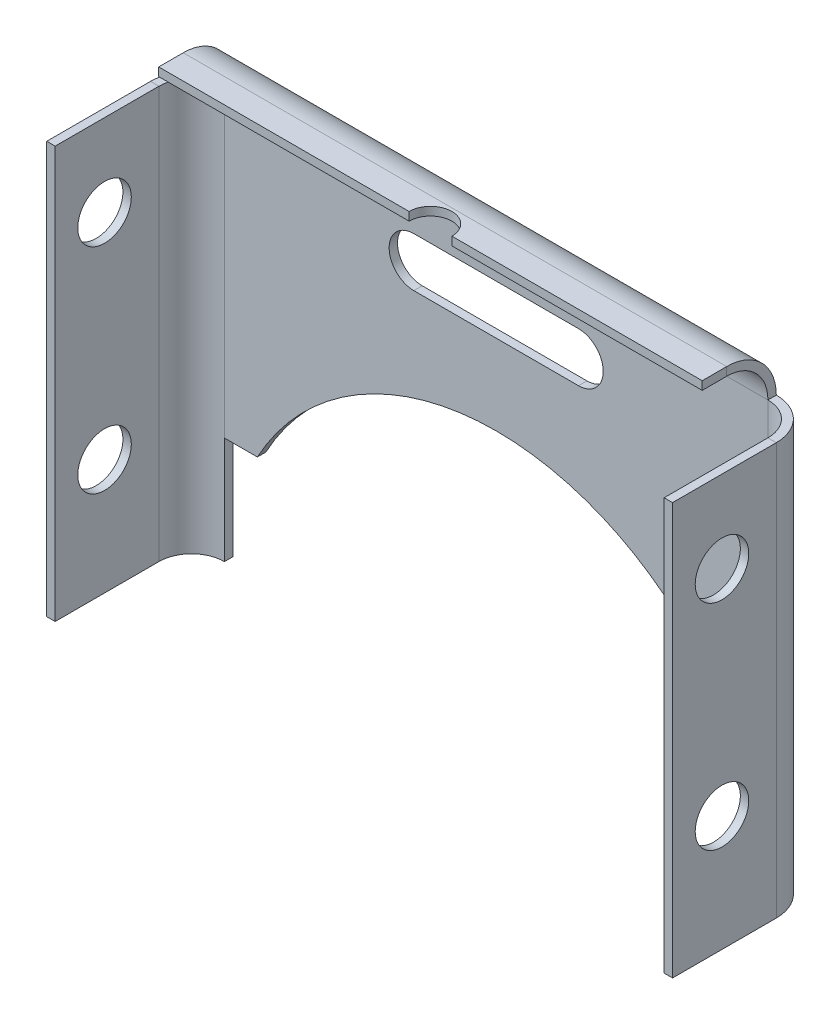
ISO-10303-21;
HEADER;
FILE_DESCRIPTION(('STEP AP214'),'2;1');
FILE_NAME('part.step','',(''),(''),'','','');
FILE_SCHEMA(('AUTOMOTIVE_DESIGN { 1 0 10303 214 1 1 1 1 }'));
ENDSEC;
DATA;
#1=APPLICATION_CONTEXT('core data for automotive mechanical design processes');
#2=APPLICATION_PROTOCOL_DEFINITION('international standard','automotive_design',2000,#1);
#3=PRODUCT_CONTEXT('',#1,'mechanical');
#4=PRODUCT('Part','Part','',(#3));
#5=PRODUCT_RELATED_PRODUCT_CATEGORY('part','',(#4));
#6=PRODUCT_DEFINITION_FORMATION('','',#4);
#7=PRODUCT_DEFINITION_CONTEXT('part definition',#1,'design');
#8=PRODUCT_DEFINITION('design','',#6,#7);
#9=PRODUCT_DEFINITION_SHAPE('','',#8);
#10=(LENGTH_UNIT() NAMED_UNIT(*) SI_UNIT(.MILLI.,.METRE.));
#11=(NAMED_UNIT(*) PLANE_ANGLE_UNIT() SI_UNIT($,.RADIAN.));
#12=(NAMED_UNIT(*) SI_UNIT($,.STERADIAN.) SOLID_ANGLE_UNIT());
#13=UNCERTAINTY_MEASURE_WITH_UNIT(LENGTH_MEASURE(1.E-05),#10,'distance_accuracy_value','');
#14=(GEOMETRIC_REPRESENTATION_CONTEXT(3) GLOBAL_UNCERTAINTY_ASSIGNED_CONTEXT((#13)) GLOBAL_UNIT_ASSIGNED_CONTEXT((#10,
#11,#12)) REPRESENTATION_CONTEXT('',''));
#15=CARTESIAN_POINT('',(0.,0.,0.));
#16=DIRECTION('',(0.,0.,1.));
#17=DIRECTION('',(1.,0.,0.));
#18=AXIS2_PLACEMENT_3D('',#15,#16,#17);
#19=CARTESIAN_POINT('',(-1.65,0.301000000000001,0.45));
#20=DIRECTION('',(0.,0.,1.));
#21=DIRECTION('',(0.,-1.,0.));
#22=AXIS2_PLACEMENT_3D('',#19,#20,#21);
#23=PLANE('',#22);
#24=DIRECTION('',(0.,1.,0.));
#25=VECTOR('',#24,1.);
#26=CARTESIAN_POINT('',(0.13,0.250000000000001,0.45));
#27=LINE('',#26,#25);
#28=CARTESIAN_POINT('',(0.13,0.250000000000001,0.45));
#29=VERTEX_POINT('',#28);
#30=CARTESIAN_POINT('',(0.13,0.301000000000001,0.45));
#31=VERTEX_POINT('',#30);
#32=EDGE_CURVE('E236',#29,#31,#27,.T.);
#33=ORIENTED_EDGE('',*,*,#32,.F.);
#34=DIRECTION('',(1.,0.,0.));
#35=VECTOR('',#34,1.);
#36=CARTESIAN_POINT('',(0.,0.250000000000001,0.45));
#37=LINE('',#36,#35);
#38=CARTESIAN_POINT('',(1.65,0.250000000000001,0.45));
#39=VERTEX_POINT('',#38);
#40=EDGE_CURVE('E245',#39,#29,#37,.F.);
#41=ORIENTED_EDGE('',*,*,#40,.F.);
#42=DIRECTION('',(0.,-1.,0.));
#43=VECTOR('',#42,1.);
#44=CARTESIAN_POINT('',(1.65,0.301000000000001,0.45));
#45=LINE('',#44,#43);
#46=CARTESIAN_POINT('',(1.65,0.301000000000001,0.45));
#47=VERTEX_POINT('',#46);
#48=EDGE_CURVE('E457',#47,#39,#45,.T.);
#49=ORIENTED_EDGE('',*,*,#48,.F.);
#50=DIRECTION('',(-1.,0.,0.));
#51=VECTOR('',#50,1.);
#52=CARTESIAN_POINT('',(-1.65,0.301000000000001,0.45));
#53=LINE('',#52,#51);
#54=EDGE_CURVE('E463',#47,#31,#53,.T.);
#55=ORIENTED_EDGE('',*,*,#54,.T.);
#56=EDGE_LOOP('',(#33,#41,#49,#55));
#57=FACE_BOUND('',#56,.T.);
#58=ADVANCED_FACE('F57',(#57),#23,.T.);
#59=CARTESIAN_POINT('',(-1.9,-2.5,0.250000000000001));
#60=DIRECTION('',(0.,-1.,0.));
#61=DIRECTION('',(0.,0.,-1.));
#62=AXIS2_PLACEMENT_3D('',#59,#60,#61);
#63=PLANE('',#62);
#64=DIRECTION('',(1.,0.,0.));
#65=VECTOR('',#64,1.);
#66=CARTESIAN_POINT('',(-1.9,-2.5,0.250000000000001));
#67=LINE('',#66,#65);
#68=CARTESIAN_POINT('',(-1.9,-2.5,0.250000000000001));
#69=VERTEX_POINT('',#68);
#70=CARTESIAN_POINT('',(-1.849,-2.5,0.250000000000001));
#71=VERTEX_POINT('',#70);
#72=EDGE_CURVE('E396',#69,#71,#67,.T.);
#73=ORIENTED_EDGE('',*,*,#72,.F.);
#74=CARTESIAN_POINT('',(-1.65,-2.5,0.250000000000001));
#75=DIRECTION('',(0.,-1.,0.));
#76=DIRECTION('',(0.,0.,1.));
#77=AXIS2_PLACEMENT_3D('',#74,#75,#76);
#78=CIRCLE('',#77,0.25);
#79=CARTESIAN_POINT('',(-1.65,-2.5,0.));
#80=VERTEX_POINT('',#79);
#81=EDGE_CURVE('E294',#69,#80,#78,.T.);
#82=ORIENTED_EDGE('',*,*,#81,.T.);
#83=DIRECTION('',(0.,0.,-1.));
#84=VECTOR('',#83,1.);
#85=CARTESIAN_POINT('',(-1.65,-2.5,0.051));
#86=LINE('',#85,#84);
#87=CARTESIAN_POINT('',(-1.65,-2.5,0.0509999999999997));
#88=VERTEX_POINT('',#87);
#89=EDGE_CURVE('E394',#88,#80,#86,.T.);
#90=ORIENTED_EDGE('',*,*,#89,.F.);
#91=CARTESIAN_POINT('',(-1.65,-2.5,0.250000000000001));
#92=DIRECTION('',(0.,1.,0.));
#93=DIRECTION('',(1.,0.,0.));
#94=AXIS2_PLACEMENT_3D('',#91,#92,#93);
#95=CIRCLE('',#94,0.199);
#96=EDGE_CURVE('E305',#71,#88,#95,.F.);
#97=ORIENTED_EDGE('',*,*,#96,.F.);
#98=EDGE_LOOP('',(#73,#82,#90,#97));
#99=FACE_BOUND('',#98,.T.);
#100=ADVANCED_FACE('F59',(#99),#63,.T.);
#101=CARTESIAN_POINT('',(-1.65,-2.5,0.051));
#102=DIRECTION('',(0.,-1.,0.));
#103=DIRECTION('',(0.,0.,-1.));
#104=AXIS2_PLACEMENT_3D('',#101,#102,#103);
#105=PLANE('',#104);
#106=DIRECTION('',(0.,0.,-1.));
#107=VECTOR('',#106,1.);
#108=CARTESIAN_POINT('',(-1.9,-2.5,0.250000000000001));
#109=LINE('',#108,#107);
#110=CARTESIAN_POINT('',(-1.9,-2.5,0.88));
#111=VERTEX_POINT('',#110);
#112=EDGE_CURVE('E297',#111,#69,#109,.T.);
#113=ORIENTED_EDGE('',*,*,#112,.T.);
#114=ORIENTED_EDGE('',*,*,#72,.T.);
#115=DIRECTION('',(0.,0.,-1.));
#116=VECTOR('',#115,1.);
#117=CARTESIAN_POINT('',(-1.849,-2.5,0.250000000000001));
#118=LINE('',#117,#116);
#119=CARTESIAN_POINT('',(-1.849,-2.5,0.88));
#120=VERTEX_POINT('',#119);
#121=EDGE_CURVE('E302',#120,#71,#118,.T.);
#122=ORIENTED_EDGE('',*,*,#121,.F.);
#123=DIRECTION('',(-1.,0.,0.));
#124=VECTOR('',#123,1.);
#125=CARTESIAN_POINT('',(-1.849,-2.5,0.88));
#126=LINE('',#125,#124);
#127=EDGE_CURVE('E300',#120,#111,#126,.T.);
#128=ORIENTED_EDGE('',*,*,#127,.T.);
#129=EDGE_LOOP('',(#113,#114,#122,#128));
#130=FACE_BOUND('',#129,.T.);
#131=ADVANCED_FACE('F550',(#130),#105,.T.);
#132=CARTESIAN_POINT('',(-1.65,0.,0.));
#133=DIRECTION('',(0.,1.,0.));
#134=DIRECTION('',(0.,0.,1.));
#135=AXIS2_PLACEMENT_3D('',#132,#133,#134);
#136=PLANE('',#135);
#137=DIRECTION('',(0.,0.,1.));
#138=VECTOR('',#137,1.);
#139=CARTESIAN_POINT('',(-1.65,0.,0.));
#140=LINE('',#139,#138);
#141=CARTESIAN_POINT('',(-1.65,0.,0.));
#142=VERTEX_POINT('',#141);
#143=CARTESIAN_POINT('',(-1.65,0.,0.051));
#144=VERTEX_POINT('',#143);
#145=EDGE_CURVE('E391',#142,#144,#140,.T.);
#146=ORIENTED_EDGE('',*,*,#145,.F.);
#147=CARTESIAN_POINT('',(-1.65,0.,0.250000000000001));
#148=DIRECTION('',(0.,-1.,0.));
#149=DIRECTION('',(0.,0.,1.));
#150=AXIS2_PLACEMENT_3D('',#147,#148,#149);
#151=CIRCLE('',#150,0.25);
#152=CARTESIAN_POINT('',(-1.9,0.,0.250000000000001));
#153=VERTEX_POINT('',#152);
#154=EDGE_CURVE('E325',#153,#142,#151,.T.);
#155=ORIENTED_EDGE('',*,*,#154,.F.);
#156=DIRECTION('',(-1.,0.,0.));
#157=VECTOR('',#156,1.);
#158=CARTESIAN_POINT('',(-1.849,0.,0.250000000000001));
#159=LINE('',#158,#157);
#160=CARTESIAN_POINT('',(-1.849,0.,0.250000000000001));
#161=VERTEX_POINT('',#160);
#162=EDGE_CURVE('E389',#161,#153,#159,.T.);
#163=ORIENTED_EDGE('',*,*,#162,.F.);
#164=CARTESIAN_POINT('',(-1.65,0.,0.250000000000001));
#165=DIRECTION('',(0.,1.,0.));
#166=DIRECTION('',(1.,0.,0.));
#167=AXIS2_PLACEMENT_3D('',#164,#165,#166);
#168=CIRCLE('',#167,0.199);
#169=EDGE_CURVE('E336',#161,#144,#168,.F.);
#170=ORIENTED_EDGE('',*,*,#169,.T.);
#171=EDGE_LOOP('',(#146,#155,#163,#170));
#172=FACE_BOUND('',#171,.T.);
#173=ADVANCED_FACE('F648',(#172),#136,.T.);
#174=CARTESIAN_POINT('',(1.65,-2.5,0.));
#175=DIRECTION('',(0.,-1.,0.));
#176=DIRECTION('',(0.,0.,-1.));
#177=AXIS2_PLACEMENT_3D('',#174,#175,#176);
#178=PLANE('',#177);
#179=DIRECTION('',(0.,0.,1.));
#180=VECTOR('',#179,1.);
#181=CARTESIAN_POINT('',(1.65,-2.5,0.));
#182=LINE('',#181,#180);
#183=CARTESIAN_POINT('',(1.65,-2.5,0.));
#184=VERTEX_POINT('',#183);
#185=CARTESIAN_POINT('',(1.65,-2.5,0.0509999999999997));
#186=VERTEX_POINT('',#185);
#187=EDGE_CURVE('E387',#184,#186,#182,.T.);
#188=ORIENTED_EDGE('',*,*,#187,.F.);
#189=CARTESIAN_POINT('',(1.65,-2.5,0.25));
#190=DIRECTION('',(0.,-1.,0.));
#191=DIRECTION('',(0.,0.,-1.));
#192=AXIS2_PLACEMENT_3D('',#189,#190,#191);
#193=CIRCLE('',#192,0.25);
#194=CARTESIAN_POINT('',(1.9,-2.5,0.25));
#195=VERTEX_POINT('',#194);
#196=EDGE_CURVE('E291',#184,#195,#193,.T.);
#197=ORIENTED_EDGE('',*,*,#196,.T.);
#198=DIRECTION('',(1.,0.,0.));
#199=VECTOR('',#198,1.);
#200=CARTESIAN_POINT('',(1.849,-2.5,0.25));
#201=LINE('',#200,#199);
#202=CARTESIAN_POINT('',(1.849,-2.5,0.25));
#203=VERTEX_POINT('',#202);
#204=EDGE_CURVE('E385',#203,#195,#201,.T.);
#205=ORIENTED_EDGE('',*,*,#204,.F.);
#206=CARTESIAN_POINT('',(1.65,-2.5,0.25));
#207=DIRECTION('',(0.,1.,0.));
#208=DIRECTION('',(1.,0.,0.));
#209=AXIS2_PLACEMENT_3D('',#206,#207,#208);
#210=CIRCLE('',#209,0.199);
#211=EDGE_CURVE('E308',#186,#203,#210,.F.);
#212=ORIENTED_EDGE('',*,*,#211,.F.);
#213=EDGE_LOOP('',(#188,#197,#205,#212));
#214=FACE_BOUND('',#213,.T.);
#215=ADVANCED_FACE('F644',(#214),#178,.T.);
#216=CARTESIAN_POINT('',(1.9,0.,0.25));
#217=DIRECTION('',(0.,1.,0.));
#218=DIRECTION('',(0.,0.,1.));
#219=AXIS2_PLACEMENT_3D('',#216,#217,#218);
#220=PLANE('',#219);
#221=DIRECTION('',(-1.,0.,0.));
#222=VECTOR('',#221,1.);
#223=CARTESIAN_POINT('',(1.9,0.,0.25));
#224=LINE('',#223,#222);
#225=CARTESIAN_POINT('',(1.9,0.,0.25));
#226=VERTEX_POINT('',#225);
#227=CARTESIAN_POINT('',(1.849,0.,0.25));
#228=VERTEX_POINT('',#227);
#229=EDGE_CURVE('E383',#226,#228,#224,.T.);
#230=ORIENTED_EDGE('',*,*,#229,.F.);
#231=CARTESIAN_POINT('',(1.65,0.,0.25));
#232=DIRECTION('',(0.,-1.,0.));
#233=DIRECTION('',(0.,0.,-1.));
#234=AXIS2_PLACEMENT_3D('',#231,#232,#233);
#235=CIRCLE('',#234,0.25);
#236=CARTESIAN_POINT('',(1.65,0.,0.));
#237=VERTEX_POINT('',#236);
#238=EDGE_CURVE('E319',#237,#226,#235,.T.);
#239=ORIENTED_EDGE('',*,*,#238,.F.);
#240=DIRECTION('',(0.,0.,-1.));
#241=VECTOR('',#240,1.);
#242=CARTESIAN_POINT('',(1.65,0.,0.0509999999999997));
#243=LINE('',#242,#241);
#244=CARTESIAN_POINT('',(1.65,0.,0.0509999999999997));
#245=VERTEX_POINT('',#244);
#246=EDGE_CURVE('E347',#245,#237,#243,.T.);
#247=ORIENTED_EDGE('',*,*,#246,.F.);
#248=CARTESIAN_POINT('',(1.65,0.,0.25));
#249=DIRECTION('',(0.,1.,0.));
#250=DIRECTION('',(1.,0.,0.));
#251=AXIS2_PLACEMENT_3D('',#248,#249,#250);
#252=CIRCLE('',#251,0.199);
#253=EDGE_CURVE('E287',#245,#228,#252,.F.);
#254=ORIENTED_EDGE('',*,*,#253,.T.);
#255=EDGE_LOOP('',(#230,#239,#247,#254));
#256=FACE_BOUND('',#255,.T.);
#257=ADVANCED_FACE('F640',(#256),#220,.T.);
#258=CARTESIAN_POINT('',(1.65,0.,0.0509999999999997));
#259=DIRECTION('',(0.,1.,0.));
#260=DIRECTION('',(0.,0.,1.));
#261=AXIS2_PLACEMENT_3D('',#258,#259,#260);
#262=PLANE('',#261);
#263=DIRECTION('',(0.,0.,1.));
#264=VECTOR('',#263,1.);
#265=CARTESIAN_POINT('',(1.9,0.,0.25));
#266=LINE('',#265,#264);
#267=CARTESIAN_POINT('',(1.9,0.,0.879999999999999));
#268=VERTEX_POINT('',#267);
#269=EDGE_CURVE('E317',#226,#268,#266,.T.);
#270=ORIENTED_EDGE('',*,*,#269,.F.);
#271=ORIENTED_EDGE('',*,*,#229,.T.);
#272=DIRECTION('',(0.,0.,1.));
#273=VECTOR('',#272,1.);
#274=CARTESIAN_POINT('',(1.849,0.,0.25));
#275=LINE('',#274,#273);
#276=CARTESIAN_POINT('',(1.849,0.,0.879999999999999));
#277=VERTEX_POINT('',#276);
#278=EDGE_CURVE('E273',#228,#277,#275,.T.);
#279=ORIENTED_EDGE('',*,*,#278,.T.);
#280=DIRECTION('',(-1.,0.,0.));
#281=VECTOR('',#280,1.);
#282=CARTESIAN_POINT('',(1.9,0.,0.879999999999999));
#283=LINE('',#282,#281);
#284=EDGE_CURVE('E314',#268,#277,#283,.T.);
#285=ORIENTED_EDGE('',*,*,#284,.F.);
#286=EDGE_LOOP('',(#270,#271,#279,#285));
#287=FACE_BOUND('',#286,.T.);
#288=ADVANCED_FACE('F636',(#287),#262,.T.);
#289=CARTESIAN_POINT('',(1.849,-2.5,0.25));
#290=DIRECTION('',(-1.,0.,0.));
#291=DIRECTION('',(0.,0.,1.));
#292=AXIS2_PLACEMENT_3D('',#289,#290,#291);
#293=PLANE('',#292);
#294=CARTESIAN_POINT('',(1.849,-0.498518338289067,0.58));
#295=DIRECTION('',(-1.,0.,0.));
#296=DIRECTION('',(0.,0.,1.));
#297=AXIS2_PLACEMENT_3D('',#294,#295,#296);
#298=CIRCLE('',#297,0.1625);
#299=CARTESIAN_POINT('',(1.849,-0.498518338289067,0.7425));
#300=VERTEX_POINT('',#299);
#301=EDGE_CURVE('E440',#300,#300,#298,.T.);
#302=ORIENTED_EDGE('',*,*,#301,.F.);
#303=EDGE_LOOP('',(#302));
#304=FACE_BOUND('',#303,.T.);
#305=CARTESIAN_POINT('',(1.849,-1.79851833828907,0.58));
#306=DIRECTION('',(-1.,0.,0.));
#307=DIRECTION('',(0.,0.,1.));
#308=AXIS2_PLACEMENT_3D('',#305,#306,#307);
#309=CIRCLE('',#308,0.1625);
#310=CARTESIAN_POINT('',(1.849,-1.79851833828907,0.7425));
#311=VERTEX_POINT('',#310);
#312=EDGE_CURVE('E508',#311,#311,#309,.T.);
#313=ORIENTED_EDGE('',*,*,#312,.F.);
#314=EDGE_LOOP('',(#313));
#315=FACE_BOUND('',#314,.T.);
#316=ORIENTED_EDGE('',*,*,#278,.F.);
#317=DIRECTION('',(0.,1.,0.));
#318=VECTOR('',#317,1.);
#319=CARTESIAN_POINT('',(1.849,-2.5,0.25));
#320=LINE('',#319,#318);
#321=EDGE_CURVE('E344',#203,#228,#320,.T.);
#322=ORIENTED_EDGE('',*,*,#321,.F.);
#323=DIRECTION('',(0.,0.,1.));
#324=VECTOR('',#323,1.);
#325=CARTESIAN_POINT('',(1.849,-2.5,0.25));
#326=LINE('',#325,#324);
#327=CARTESIAN_POINT('',(1.849,-2.5,0.879999999999999));
#328=VERTEX_POINT('',#327);
#329=EDGE_CURVE('E283',#203,#328,#326,.T.);
#330=ORIENTED_EDGE('',*,*,#329,.T.);
#331=DIRECTION('',(0.,1.,0.));
#332=VECTOR('',#331,1.);
#333=CARTESIAN_POINT('',(1.849,-2.5,0.879999999999999));
#334=LINE('',#333,#332);
#335=EDGE_CURVE('E311',#328,#277,#334,.T.);
#336=ORIENTED_EDGE('',*,*,#335,.T.);
#337=EDGE_LOOP('',(#316,#322,#330,#336));
#338=FACE_BOUND('',#337,.T.);
#339=ADVANCED_FACE('F597',(#304,#315,#338),#293,.T.);
#340=CARTESIAN_POINT('',(1.65,-2.5,0.25));
#341=DIRECTION('',(0.,1.,0.));
#342=DIRECTION('',(0.,0.,1.));
#343=AXIS2_PLACEMENT_3D('',#340,#341,#342);
#344=CYLINDRICAL_SURFACE('',#343,0.199);
#345=ORIENTED_EDGE('',*,*,#253,.F.);
#346=DIRECTION('',(0.,1.,0.));
#347=VECTOR('',#346,1.);
#348=CARTESIAN_POINT('',(1.65,-2.5,0.0509999999999997));
#349=LINE('',#348,#347);
#350=CARTESIAN_POINT('',(1.65,-1.85,0.0509999999999997));
#351=VERTEX_POINT('',#350);
#352=EDGE_CURVE('E351',#351,#245,#349,.T.);
#353=ORIENTED_EDGE('',*,*,#352,.F.);
#354=EDGE_CURVE('E348',#186,#351,#349,.T.);
#355=ORIENTED_EDGE('',*,*,#354,.F.);
#356=ORIENTED_EDGE('',*,*,#211,.T.);
#357=ORIENTED_EDGE('',*,*,#321,.T.);
#358=EDGE_LOOP('',(#345,#353,#355,#356,#357));
#359=FACE_BOUND('',#358,.T.);
#360=ADVANCED_FACE('F594',(#359),#344,.F.);
#361=CARTESIAN_POINT('',(-1.65,-2.5,0.051));
#362=DIRECTION('',(0.,0.,1.));
#363=DIRECTION('',(1.,0.,0.));
#364=AXIS2_PLACEMENT_3D('',#361,#362,#363);
#365=PLANE('',#364);
#366=CARTESIAN_POINT('',(-0.5,-0.35,0.0509999999999997));
#367=DIRECTION('',(0.,0.,1.));
#368=DIRECTION('',(1.,0.,0.));
#369=AXIS2_PLACEMENT_3D('',#366,#367,#368);
#370=CIRCLE('',#369,0.15);
#371=CARTESIAN_POINT('',(-0.5,-0.2,0.0509999999999997));
#372=VERTEX_POINT('',#371);
#373=CARTESIAN_POINT('',(-0.5,-0.5,0.0509999999999998));
#374=VERTEX_POINT('',#373);
#375=EDGE_CURVE('E80',#372,#374,#370,.T.);
#376=ORIENTED_EDGE('',*,*,#375,.F.);
#377=DIRECTION('',(-1.,0.,0.));
#378=VECTOR('',#377,1.);
#379=CARTESIAN_POINT('',(-0.5,-0.2,0.0509999999999997));
#380=LINE('',#379,#378);
#381=CARTESIAN_POINT('',(0.5,-0.2,0.0509999999999997));
#382=VERTEX_POINT('',#381);
#383=EDGE_CURVE('E435',#382,#372,#380,.T.);
#384=ORIENTED_EDGE('',*,*,#383,.F.);
#385=CARTESIAN_POINT('',(0.5,-0.35,0.0509999999999997));
#386=DIRECTION('',(0.,0.,1.));
#387=DIRECTION('',(1.,0.,0.));
#388=AXIS2_PLACEMENT_3D('',#385,#386,#387);
#389=CIRCLE('',#388,0.15);
#390=CARTESIAN_POINT('',(0.5,-0.5,0.0509999999999997));
#391=VERTEX_POINT('',#390);
#392=EDGE_CURVE('E425',#391,#382,#389,.T.);
#393=ORIENTED_EDGE('',*,*,#392,.F.);
#394=DIRECTION('',(1.,0.,0.));
#395=VECTOR('',#394,1.);
#396=CARTESIAN_POINT('',(-0.5,-0.5,0.0509999999999997));
#397=LINE('',#396,#395);
#398=EDGE_CURVE('E520',#374,#391,#397,.T.);
#399=ORIENTED_EDGE('',*,*,#398,.F.);
#400=EDGE_LOOP('',(#376,#384,#393,#399));
#401=FACE_BOUND('',#400,.T.);
#402=DIRECTION('',(-1.,0.,0.));
#403=VECTOR('',#402,1.);
#404=CARTESIAN_POINT('',(1.65,-1.85,0.0509999999999997));
#405=LINE('',#404,#403);
#406=CARTESIAN_POINT('',(1.45,-1.85,0.0509999999999997));
#407=VERTEX_POINT('',#406);
#408=EDGE_CURVE('E443',#351,#407,#405,.T.);
#409=ORIENTED_EDGE('',*,*,#408,.F.);
#410=ORIENTED_EDGE('',*,*,#352,.T.);
#411=DIRECTION('',(1.,0.,0.));
#412=VECTOR('',#411,1.);
#413=CARTESIAN_POINT('',(-1.65,0.,0.051));
#414=LINE('',#413,#412);
#415=EDGE_CURVE('E339',#144,#245,#414,.T.);
#416=ORIENTED_EDGE('',*,*,#415,.F.);
#417=DIRECTION('',(0.,1.,0.));
#418=VECTOR('',#417,1.);
#419=CARTESIAN_POINT('',(-1.65,-2.5,0.051));
#420=LINE('',#419,#418);
#421=CARTESIAN_POINT('',(-1.65,-1.85,0.0509999999999997));
#422=VERTEX_POINT('',#421);
#423=EDGE_CURVE('E355',#422,#144,#420,.T.);
#424=ORIENTED_EDGE('',*,*,#423,.F.);
#425=DIRECTION('',(-1.,0.,0.));
#426=VECTOR('',#425,1.);
#427=CARTESIAN_POINT('',(-1.45,-1.85,0.0509999999999997));
#428=LINE('',#427,#426);
#429=CARTESIAN_POINT('',(-1.45,-1.85,0.0509999999999997));
#430=VERTEX_POINT('',#429);
#431=EDGE_CURVE('E439',#430,#422,#428,.T.);
#432=ORIENTED_EDGE('',*,*,#431,.F.);
#433=CARTESIAN_POINT('',(0.,-2.63740078740118,0.0509999999999997));
#434=DIRECTION('',(0.,0.,1.));
#435=DIRECTION('',(1.,0.,0.));
#436=AXIS2_PLACEMENT_3D('',#433,#434,#435);
#437=CIRCLE('',#436,1.65);
#438=EDGE_CURVE('E436',#407,#430,#437,.T.);
#439=ORIENTED_EDGE('',*,*,#438,.F.);
#440=EDGE_LOOP('',(#409,#410,#416,#424,#432,#439));
#441=FACE_BOUND('',#440,.T.);
#442=ADVANCED_FACE('F525',(#401,#441),#365,.T.);
#443=CARTESIAN_POINT('',(-1.65,-2.5,0.250000000000001));
#444=DIRECTION('',(0.,1.,0.));
#445=DIRECTION('',(0.,0.,1.));
#446=AXIS2_PLACEMENT_3D('',#443,#444,#445);
#447=CYLINDRICAL_SURFACE('',#446,0.199);
#448=ORIENTED_EDGE('',*,*,#169,.F.);
#449=DIRECTION('',(0.,1.,0.));
#450=VECTOR('',#449,1.);
#451=CARTESIAN_POINT('',(-1.849,-2.5,0.250000000000001));
#452=LINE('',#451,#450);
#453=EDGE_CURVE('E356',#71,#161,#452,.T.);
#454=ORIENTED_EDGE('',*,*,#453,.F.);
#455=ORIENTED_EDGE('',*,*,#96,.T.);
#456=EDGE_CURVE('E352',#88,#422,#420,.T.);
#457=ORIENTED_EDGE('',*,*,#456,.T.);
#458=ORIENTED_EDGE('',*,*,#423,.T.);
#459=EDGE_LOOP('',(#448,#454,#455,#457,#458));
#460=FACE_BOUND('',#459,.T.);
#461=ADVANCED_FACE('F601',(#460),#447,.F.);
#462=CARTESIAN_POINT('',(-1.849,-2.5,0.250000000000001));
#463=DIRECTION('',(1.,0.,0.));
#464=DIRECTION('',(0.,0.,-1.));
#465=AXIS2_PLACEMENT_3D('',#462,#463,#464);
#466=PLANE('',#465);
#467=CARTESIAN_POINT('',(-1.849,-0.498518338289067,0.58));
#468=DIRECTION('',(1.,0.,0.));
#469=DIRECTION('',(0.,0.,-1.));
#470=AXIS2_PLACEMENT_3D('',#467,#468,#469);
#471=CIRCLE('',#470,0.1625);
#472=CARTESIAN_POINT('',(-1.849,-0.498518338289067,0.4175));
#473=VERTEX_POINT('',#472);
#474=EDGE_CURVE('E514',#473,#473,#471,.T.);
#475=ORIENTED_EDGE('',*,*,#474,.F.);
#476=EDGE_LOOP('',(#475));
#477=FACE_BOUND('',#476,.T.);
#478=CARTESIAN_POINT('',(-1.849,-1.79851833828907,0.58));
#479=DIRECTION('',(1.,0.,0.));
#480=DIRECTION('',(0.,0.,-1.));
#481=AXIS2_PLACEMENT_3D('',#478,#479,#480);
#482=CIRCLE('',#481,0.1625);
#483=CARTESIAN_POINT('',(-1.849,-1.79851833828907,0.4175));
#484=VERTEX_POINT('',#483);
#485=EDGE_CURVE('E505',#484,#484,#482,.T.);
#486=ORIENTED_EDGE('',*,*,#485,.F.);
#487=EDGE_LOOP('',(#486));
#488=FACE_BOUND('',#487,.T.);
#489=DIRECTION('',(0.,0.,-1.));
#490=VECTOR('',#489,1.);
#491=CARTESIAN_POINT('',(-1.849,0.,0.250000000000001));
#492=LINE('',#491,#490);
#493=CARTESIAN_POINT('',(-1.849,0.,0.88));
#494=VERTEX_POINT('',#493);
#495=EDGE_CURVE('E333',#494,#161,#492,.T.);
#496=ORIENTED_EDGE('',*,*,#495,.F.);
#497=DIRECTION('',(0.,1.,0.));
#498=VECTOR('',#497,1.);
#499=CARTESIAN_POINT('',(-1.849,-2.5,0.88));
#500=LINE('',#499,#498);
#501=EDGE_CURVE('E359',#120,#494,#500,.T.);
#502=ORIENTED_EDGE('',*,*,#501,.F.);
#503=ORIENTED_EDGE('',*,*,#121,.T.);
#504=ORIENTED_EDGE('',*,*,#453,.T.);
#505=EDGE_LOOP('',(#496,#502,#503,#504));
#506=FACE_BOUND('',#505,.T.);
#507=ADVANCED_FACE('F604',(#477,#488,#506),#466,.T.);
#508=CARTESIAN_POINT('',(-1.849,-2.5,0.88));
#509=DIRECTION('',(0.,0.,-1.));
#510=DIRECTION('',(-1.,0.,0.));
#511=AXIS2_PLACEMENT_3D('',#508,#509,#510);
#512=PLANE('',#511);
#513=DIRECTION('',(-1.,0.,0.));
#514=VECTOR('',#513,1.);
#515=CARTESIAN_POINT('',(-1.849,0.,0.88));
#516=LINE('',#515,#514);
#517=CARTESIAN_POINT('',(-1.9,0.,0.88));
#518=VERTEX_POINT('',#517);
#519=EDGE_CURVE('E331',#494,#518,#516,.T.);
#520=ORIENTED_EDGE('',*,*,#519,.T.);
#521=DIRECTION('',(0.,1.,0.));
#522=VECTOR('',#521,1.);
#523=CARTESIAN_POINT('',(-1.9,-2.5,0.88));
#524=LINE('',#523,#522);
#525=EDGE_CURVE('E361',#111,#518,#524,.T.);
#526=ORIENTED_EDGE('',*,*,#525,.F.);
#527=ORIENTED_EDGE('',*,*,#127,.F.);
#528=ORIENTED_EDGE('',*,*,#501,.T.);
#529=EDGE_LOOP('',(#520,#526,#527,#528));
#530=FACE_BOUND('',#529,.T.);
#531=ADVANCED_FACE('F608',(#530),#512,.F.);
#532=CARTESIAN_POINT('',(-1.9,-2.5,0.250000000000001));
#533=DIRECTION('',(1.,0.,0.));
#534=DIRECTION('',(0.,0.,-1.));
#535=AXIS2_PLACEMENT_3D('',#532,#533,#534);
#536=PLANE('',#535);
#537=CARTESIAN_POINT('',(-1.9,-0.498518338289067,0.58));
#538=DIRECTION('',(1.,0.,0.));
#539=DIRECTION('',(0.,0.,-1.));
#540=AXIS2_PLACEMENT_3D('',#537,#538,#539);
#541=CIRCLE('',#540,0.1625);
#542=CARTESIAN_POINT('',(-1.9,-0.498518338289067,0.4175));
#543=VERTEX_POINT('',#542);
#544=EDGE_CURVE('E511',#543,#543,#541,.T.);
#545=ORIENTED_EDGE('',*,*,#544,.T.);
#546=EDGE_LOOP('',(#545));
#547=FACE_BOUND('',#546,.T.);
#548=CARTESIAN_POINT('',(-1.9,-1.79851833828907,0.58));
#549=DIRECTION('',(1.,0.,0.));
#550=DIRECTION('',(0.,0.,-1.));
#551=AXIS2_PLACEMENT_3D('',#548,#549,#550);
#552=CIRCLE('',#551,0.1625);
#553=CARTESIAN_POINT('',(-1.9,-1.79851833828907,0.4175));
#554=VERTEX_POINT('',#553);
#555=EDGE_CURVE('E501',#554,#554,#552,.T.);
#556=ORIENTED_EDGE('',*,*,#555,.T.);
#557=EDGE_LOOP('',(#556));
#558=FACE_BOUND('',#557,.T.);
#559=DIRECTION('',(0.,0.,-1.));
#560=VECTOR('',#559,1.);
#561=CARTESIAN_POINT('',(-1.9,0.,0.250000000000001));
#562=LINE('',#561,#560);
#563=EDGE_CURVE('E328',#518,#153,#562,.T.);
#564=ORIENTED_EDGE('',*,*,#563,.T.);
#565=DIRECTION('',(0.,1.,0.));
#566=VECTOR('',#565,1.);
#567=CARTESIAN_POINT('',(-1.9,-2.5,0.250000000000001));
#568=LINE('',#567,#566);
#569=EDGE_CURVE('E364',#69,#153,#568,.T.);
#570=ORIENTED_EDGE('',*,*,#569,.F.);
#571=ORIENTED_EDGE('',*,*,#112,.F.);
#572=ORIENTED_EDGE('',*,*,#525,.T.);
#573=EDGE_LOOP('',(#564,#570,#571,#572));
#574=FACE_BOUND('',#573,.T.);
#575=ADVANCED_FACE('F612',(#547,#558,#574),#536,.F.);
#576=CARTESIAN_POINT('',(-1.65,-2.5,0.250000000000001));
#577=DIRECTION('',(0.,1.,0.));
#578=DIRECTION('',(0.,0.,1.));
#579=AXIS2_PLACEMENT_3D('',#576,#577,#578);
#580=CYLINDRICAL_SURFACE('',#579,0.25);
#581=ORIENTED_EDGE('',*,*,#154,.T.);
#582=DIRECTION('',(0.,1.,0.));
#583=VECTOR('',#582,1.);
#584=CARTESIAN_POINT('',(-1.65,-2.5,0.));
#585=LINE('',#584,#583);
#586=CARTESIAN_POINT('',(-1.65,-1.85,0.));
#587=VERTEX_POINT('',#586);
#588=EDGE_CURVE('E369',#587,#142,#585,.T.);
#589=ORIENTED_EDGE('',*,*,#588,.F.);
#590=EDGE_CURVE('E367',#80,#587,#585,.T.);
#591=ORIENTED_EDGE('',*,*,#590,.F.);
#592=ORIENTED_EDGE('',*,*,#81,.F.);
#593=ORIENTED_EDGE('',*,*,#569,.T.);
#594=EDGE_LOOP('',(#581,#589,#591,#592,#593));
#595=FACE_BOUND('',#594,.T.);
#596=ADVANCED_FACE('F616',(#595),#580,.T.);
#597=CARTESIAN_POINT('',(-1.65,-2.5,0.));
#598=DIRECTION('',(0.,0.,1.));
#599=DIRECTION('',(1.,0.,0.));
#600=AXIS2_PLACEMENT_3D('',#597,#598,#599);
#601=PLANE('',#600);
#602=DIRECTION('',(-1.,0.,0.));
#603=VECTOR('',#602,1.);
#604=CARTESIAN_POINT('',(-1.65,-0.2,0.));
#605=LINE('',#604,#603);
#606=CARTESIAN_POINT('',(0.5,-0.2,0.));
#607=VERTEX_POINT('',#606);
#608=CARTESIAN_POINT('',(-0.5,-0.2,0.));
#609=VERTEX_POINT('',#608);
#610=EDGE_CURVE('E65',#607,#609,#605,.T.);
#611=ORIENTED_EDGE('',*,*,#610,.T.);
#612=CARTESIAN_POINT('',(-0.5,-0.35,0.));
#613=DIRECTION('',(0.,0.,1.));
#614=DIRECTION('',(1.,0.,0.));
#615=AXIS2_PLACEMENT_3D('',#612,#613,#614);
#616=CIRCLE('',#615,0.15);
#617=CARTESIAN_POINT('',(-0.5,-0.5,0.));
#618=VERTEX_POINT('',#617);
#619=EDGE_CURVE('E13',#609,#618,#616,.T.);
#620=ORIENTED_EDGE('',*,*,#619,.T.);
#621=DIRECTION('',(1.,0.,0.));
#622=VECTOR('',#621,1.);
#623=CARTESIAN_POINT('',(-1.65,-0.5,0.));
#624=LINE('',#623,#622);
#625=CARTESIAN_POINT('',(0.5,-0.5,0.));
#626=VERTEX_POINT('',#625);
#627=EDGE_CURVE('E404',#618,#626,#624,.T.);
#628=ORIENTED_EDGE('',*,*,#627,.T.);
#629=CARTESIAN_POINT('',(0.5,-0.35,0.));
#630=DIRECTION('',(0.,0.,1.));
#631=DIRECTION('',(1.,0.,0.));
#632=AXIS2_PLACEMENT_3D('',#629,#630,#631);
#633=CIRCLE('',#632,0.15);
#634=EDGE_CURVE('E407',#626,#607,#633,.T.);
#635=ORIENTED_EDGE('',*,*,#634,.T.);
#636=EDGE_LOOP('',(#611,#620,#628,#635));
#637=FACE_BOUND('',#636,.T.);
#638=DIRECTION('',(0.,1.,0.));
#639=VECTOR('',#638,1.);
#640=CARTESIAN_POINT('',(1.65,-2.5,0.));
#641=LINE('',#640,#639);
#642=CARTESIAN_POINT('',(1.65,-1.85,0.));
#643=VERTEX_POINT('',#642);
#644=EDGE_CURVE('E373',#643,#237,#641,.T.);
#645=ORIENTED_EDGE('',*,*,#644,.F.);
#646=DIRECTION('',(-1.,0.,0.));
#647=VECTOR('',#646,1.);
#648=CARTESIAN_POINT('',(-1.65,-1.85000000000001,0.));
#649=LINE('',#648,#647);
#650=CARTESIAN_POINT('',(1.45,-1.85,0.));
#651=VERTEX_POINT('',#650);
#652=EDGE_CURVE('E269',#643,#651,#649,.T.);
#653=ORIENTED_EDGE('',*,*,#652,.T.);
#654=CARTESIAN_POINT('',(0.,-2.63740078740118,0.));
#655=DIRECTION('',(0.,0.,1.));
#656=DIRECTION('',(1.,0.,0.));
#657=AXIS2_PLACEMENT_3D('',#654,#655,#656);
#658=CIRCLE('',#657,1.65);
#659=CARTESIAN_POINT('',(-1.45,-1.85,0.));
#660=VERTEX_POINT('',#659);
#661=EDGE_CURVE('E401',#651,#660,#658,.T.);
#662=ORIENTED_EDGE('',*,*,#661,.T.);
#663=DIRECTION('',(-1.,0.,0.));
#664=VECTOR('',#663,1.);
#665=CARTESIAN_POINT('',(-1.65,-1.85,0.));
#666=LINE('',#665,#664);
#667=EDGE_CURVE('E398',#660,#587,#666,.T.);
#668=ORIENTED_EDGE('',*,*,#667,.T.);
#669=ORIENTED_EDGE('',*,*,#588,.T.);
#670=DIRECTION('',(1.,0.,0.));
#671=VECTOR('',#670,1.);
#672=CARTESIAN_POINT('',(-1.65,0.,0.));
#673=LINE('',#672,#671);
#674=EDGE_CURVE('E322',#142,#237,#673,.T.);
#675=ORIENTED_EDGE('',*,*,#674,.T.);
#676=EDGE_LOOP('',(#645,#653,#662,#668,#669,#675));
#677=FACE_BOUND('',#676,.T.);
#678=ADVANCED_FACE('F411',(#637,#677),#601,.F.);
#679=CARTESIAN_POINT('',(1.65,-2.5,0.25));
#680=DIRECTION('',(0.,1.,0.));
#681=DIRECTION('',(0.,0.,1.));
#682=AXIS2_PLACEMENT_3D('',#679,#680,#681);
#683=CYLINDRICAL_SURFACE('',#682,0.25);
#684=ORIENTED_EDGE('',*,*,#238,.T.);
#685=DIRECTION('',(0.,1.,0.));
#686=VECTOR('',#685,1.);
#687=CARTESIAN_POINT('',(1.9,-2.5,0.25));
#688=LINE('',#687,#686);
#689=EDGE_CURVE('E374',#195,#226,#688,.T.);
#690=ORIENTED_EDGE('',*,*,#689,.F.);
#691=ORIENTED_EDGE('',*,*,#196,.F.);
#692=EDGE_CURVE('E370',#184,#643,#641,.T.);
#693=ORIENTED_EDGE('',*,*,#692,.T.);
#694=ORIENTED_EDGE('',*,*,#644,.T.);
#695=EDGE_LOOP('',(#684,#690,#691,#693,#694));
#696=FACE_BOUND('',#695,.T.);
#697=ADVANCED_FACE('F623',(#696),#683,.T.);
#698=CARTESIAN_POINT('',(1.9,-2.5,0.25));
#699=DIRECTION('',(-1.,0.,0.));
#700=DIRECTION('',(0.,0.,1.));
#701=AXIS2_PLACEMENT_3D('',#698,#699,#700);
#702=PLANE('',#701);
#703=CARTESIAN_POINT('',(1.9,-0.498518338289067,0.58));
#704=DIRECTION('',(-1.,0.,0.));
#705=DIRECTION('',(0.,0.,1.));
#706=AXIS2_PLACEMENT_3D('',#703,#704,#705);
#707=CIRCLE('',#706,0.1625);
#708=CARTESIAN_POINT('',(1.9,-0.498518338289067,0.7425));
#709=VERTEX_POINT('',#708);
#710=EDGE_CURVE('E496',#709,#709,#707,.T.);
#711=ORIENTED_EDGE('',*,*,#710,.T.);
#712=EDGE_LOOP('',(#711));
#713=FACE_BOUND('',#712,.T.);
#714=CARTESIAN_POINT('',(1.9,-1.79851833828907,0.58));
#715=DIRECTION('',(-1.,0.,0.));
#716=DIRECTION('',(0.,0.,1.));
#717=AXIS2_PLACEMENT_3D('',#714,#715,#716);
#718=CIRCLE('',#717,0.1625);
#719=CARTESIAN_POINT('',(1.9,-1.79851833828907,0.7425));
#720=VERTEX_POINT('',#719);
#721=EDGE_CURVE('E493',#720,#720,#718,.T.);
#722=ORIENTED_EDGE('',*,*,#721,.T.);
#723=EDGE_LOOP('',(#722));
#724=FACE_BOUND('',#723,.T.);
#725=ORIENTED_EDGE('',*,*,#269,.T.);
#726=DIRECTION('',(0.,1.,0.));
#727=VECTOR('',#726,1.);
#728=CARTESIAN_POINT('',(1.9,-2.5,0.879999999999999));
#729=LINE('',#728,#727);
#730=CARTESIAN_POINT('',(1.9,-2.5,0.879999999999999));
#731=VERTEX_POINT('',#730);
#732=EDGE_CURVE('E377',#731,#268,#729,.T.);
#733=ORIENTED_EDGE('',*,*,#732,.F.);
#734=DIRECTION('',(0.,0.,1.));
#735=VECTOR('',#734,1.);
#736=CARTESIAN_POINT('',(1.9,-2.5,0.25));
#737=LINE('',#736,#735);
#738=EDGE_CURVE('E289',#195,#731,#737,.T.);
#739=ORIENTED_EDGE('',*,*,#738,.F.);
#740=ORIENTED_EDGE('',*,*,#689,.T.);
#741=EDGE_LOOP('',(#725,#733,#739,#740));
#742=FACE_BOUND('',#741,.T.);
#743=ADVANCED_FACE('F626',(#713,#724,#742),#702,.F.);
#744=CARTESIAN_POINT('',(1.9,-2.5,0.879999999999999));
#745=DIRECTION('',(0.,0.,-1.));
#746=DIRECTION('',(-1.,0.,0.));
#747=AXIS2_PLACEMENT_3D('',#744,#745,#746);
#748=PLANE('',#747);
#749=ORIENTED_EDGE('',*,*,#284,.T.);
#750=ORIENTED_EDGE('',*,*,#335,.F.);
#751=DIRECTION('',(-1.,0.,0.));
#752=VECTOR('',#751,1.);
#753=CARTESIAN_POINT('',(1.9,-2.5,0.879999999999999));
#754=LINE('',#753,#752);
#755=EDGE_CURVE('E286',#731,#328,#754,.T.);
#756=ORIENTED_EDGE('',*,*,#755,.F.);
#757=ORIENTED_EDGE('',*,*,#732,.T.);
#758=EDGE_LOOP('',(#749,#750,#756,#757));
#759=FACE_BOUND('',#758,.T.);
#760=ADVANCED_FACE('F589',(#759),#748,.F.);
#761=CARTESIAN_POINT('',(1.65,-2.5,0.25));
#762=DIRECTION('',(0.,-1.,0.));
#763=DIRECTION('',(-1.,0.,0.));
#764=AXIS2_PLACEMENT_3D('',#761,#762,#763);
#765=PLANE('',#764);
#766=ORIENTED_EDGE('',*,*,#329,.F.);
#767=ORIENTED_EDGE('',*,*,#204,.T.);
#768=ORIENTED_EDGE('',*,*,#738,.T.);
#769=ORIENTED_EDGE('',*,*,#755,.T.);
#770=EDGE_LOOP('',(#766,#767,#768,#769));
#771=FACE_BOUND('',#770,.T.);
#772=ADVANCED_FACE('F586',(#771),#765,.T.);
#773=CARTESIAN_POINT('',(1.65,0.,0.25));
#774=DIRECTION('',(0.,-1.,0.));
#775=DIRECTION('',(-1.,0.,0.));
#776=AXIS2_PLACEMENT_3D('',#773,#774,#775);
#777=PLANE('',#776);
#778=ORIENTED_EDGE('',*,*,#495,.T.);
#779=ORIENTED_EDGE('',*,*,#162,.T.);
#780=ORIENTED_EDGE('',*,*,#563,.F.);
#781=ORIENTED_EDGE('',*,*,#519,.F.);
#782=EDGE_LOOP('',(#778,#779,#780,#781));
#783=FACE_BOUND('',#782,.T.);
#784=ADVANCED_FACE('F583',(#783),#777,.F.);
#785=CARTESIAN_POINT('',(1.65,0.,0.301));
#786=DIRECTION('',(1.,0.,0.));
#787=DIRECTION('',(0.,0.,-1.));
#788=AXIS2_PLACEMENT_3D('',#785,#786,#787);
#789=PLANE('',#788);
#790=DIRECTION('',(0.,1.,0.));
#791=VECTOR('',#790,1.);
#792=CARTESIAN_POINT('',(1.65,0.301,0.300999999999999));
#793=LINE('',#792,#791);
#794=CARTESIAN_POINT('',(1.65,0.25,0.300999999999999));
#795=VERTEX_POINT('',#794);
#796=CARTESIAN_POINT('',(1.65,0.301,0.300999999999999));
#797=VERTEX_POINT('',#796);
#798=EDGE_CURVE('E266',#795,#797,#793,.T.);
#799=ORIENTED_EDGE('',*,*,#798,.F.);
#800=CARTESIAN_POINT('',(1.65,0.,0.301));
#801=DIRECTION('',(-1.,0.,0.));
#802=DIRECTION('',(0.,0.,1.));
#803=AXIS2_PLACEMENT_3D('',#800,#801,#802);
#804=CIRCLE('',#803,0.25);
#805=EDGE_CURVE('E277',#245,#795,#804,.F.);
#806=ORIENTED_EDGE('',*,*,#805,.F.);
#807=ORIENTED_EDGE('',*,*,#246,.T.);
#808=CARTESIAN_POINT('',(1.65,0.,0.301));
#809=DIRECTION('',(-1.,0.,0.));
#810=DIRECTION('',(0.,0.,1.));
#811=AXIS2_PLACEMENT_3D('',#808,#809,#810);
#812=CIRCLE('',#811,0.301);
#813=EDGE_CURVE('E270',#237,#797,#812,.F.);
#814=ORIENTED_EDGE('',*,*,#813,.T.);
#815=EDGE_LOOP('',(#799,#806,#807,#814));
#816=FACE_BOUND('',#815,.T.);
#817=ADVANCED_FACE('F488',(#816),#789,.T.);
#818=CARTESIAN_POINT('',(-1.65,0.,0.301));
#819=DIRECTION('',(1.,0.,0.));
#820=DIRECTION('',(0.,0.,-1.));
#821=AXIS2_PLACEMENT_3D('',#818,#819,#820);
#822=PLANE('',#821);
#823=CARTESIAN_POINT('',(-1.65,0.,0.301));
#824=DIRECTION('',(-1.,0.,0.));
#825=DIRECTION('',(0.,0.,1.));
#826=AXIS2_PLACEMENT_3D('',#823,#824,#825);
#827=CIRCLE('',#826,0.25);
#828=CARTESIAN_POINT('',(-1.65,0.25,0.300999999999999));
#829=VERTEX_POINT('',#828);
#830=EDGE_CURVE('E280',#829,#144,#827,.T.);
#831=ORIENTED_EDGE('',*,*,#830,.F.);
#832=DIRECTION('',(0.,1.,0.));
#833=VECTOR('',#832,1.);
#834=CARTESIAN_POINT('',(-1.65,0.25,0.300999999999999));
#835=LINE('',#834,#833);
#836=CARTESIAN_POINT('',(-1.65,0.301,0.300999999999999));
#837=VERTEX_POINT('',#836);
#838=EDGE_CURVE('E261',#829,#837,#835,.T.);
#839=ORIENTED_EDGE('',*,*,#838,.T.);
#840=CARTESIAN_POINT('',(-1.65,0.,0.301));
#841=DIRECTION('',(-1.,0.,0.));
#842=DIRECTION('',(0.,0.,1.));
#843=AXIS2_PLACEMENT_3D('',#840,#841,#842);
#844=CIRCLE('',#843,0.301);
#845=EDGE_CURVE('E274',#837,#142,#844,.T.);
#846=ORIENTED_EDGE('',*,*,#845,.T.);
#847=ORIENTED_EDGE('',*,*,#145,.T.);
#848=EDGE_LOOP('',(#831,#839,#846,#847));
#849=FACE_BOUND('',#848,.T.);
#850=ADVANCED_FACE('F478',(#849),#822,.F.);
#851=CARTESIAN_POINT('',(-1.65,0.,0.301));
#852=DIRECTION('',(-1.,0.,0.));
#853=DIRECTION('',(0.,1.,0.));
#854=AXIS2_PLACEMENT_3D('',#851,#852,#853);
#855=CYLINDRICAL_SURFACE('',#854,0.301);
#856=ORIENTED_EDGE('',*,*,#674,.F.);
#857=ORIENTED_EDGE('',*,*,#845,.F.);
#858=DIRECTION('',(-1.,0.,0.));
#859=VECTOR('',#858,1.);
#860=CARTESIAN_POINT('',(0.,0.301,0.300999999999999));
#861=LINE('',#860,#859);
#862=EDGE_CURVE('E254',#797,#837,#861,.T.);
#863=ORIENTED_EDGE('',*,*,#862,.F.);
#864=ORIENTED_EDGE('',*,*,#813,.F.);
#865=EDGE_LOOP('',(#856,#857,#863,#864));
#866=FACE_BOUND('',#865,.T.);
#867=ADVANCED_FACE('F486',(#866),#855,.T.);
#868=CARTESIAN_POINT('',(-1.65,0.,0.301));
#869=DIRECTION('',(-1.,0.,0.));
#870=DIRECTION('',(0.,1.,0.));
#871=AXIS2_PLACEMENT_3D('',#868,#869,#870);
#872=CYLINDRICAL_SURFACE('',#871,0.25);
#873=ORIENTED_EDGE('',*,*,#415,.T.);
#874=ORIENTED_EDGE('',*,*,#805,.T.);
#875=DIRECTION('',(1.,0.,0.));
#876=VECTOR('',#875,1.);
#877=CARTESIAN_POINT('',(1.65,0.25,0.300999999999999));
#878=LINE('',#877,#876);
#879=EDGE_CURVE('E264',#795,#829,#878,.F.);
#880=ORIENTED_EDGE('',*,*,#879,.T.);
#881=ORIENTED_EDGE('',*,*,#830,.T.);
#882=EDGE_LOOP('',(#873,#874,#880,#881));
#883=FACE_BOUND('',#882,.T.);
#884=ADVANCED_FACE('F569',(#883),#872,.F.);
#885=CARTESIAN_POINT('',(-1.65,0.300999999999999,0.0509999999999998));
#886=DIRECTION('',(-1.,0.,0.));
#887=DIRECTION('',(0.,-1.,0.));
#888=AXIS2_PLACEMENT_3D('',#885,#886,#887);
#889=PLANE('',#888);
#890=DIRECTION('',(0.,0.,-1.));
#891=VECTOR('',#890,1.);
#892=CARTESIAN_POINT('',(-1.65,0.300999999999999,0.0509999999999998));
#893=LINE('',#892,#891);
#894=CARTESIAN_POINT('',(-1.65,0.301000000000001,0.45));
#895=VERTEX_POINT('',#894);
#896=EDGE_CURVE('E460',#895,#837,#893,.T.);
#897=ORIENTED_EDGE('',*,*,#896,.T.);
#898=ORIENTED_EDGE('',*,*,#838,.F.);
#899=DIRECTION('',(0.,0.,1.));
#900=VECTOR('',#899,1.);
#901=CARTESIAN_POINT('',(-1.65,0.249999999999999,0.));
#902=LINE('',#901,#900);
#903=CARTESIAN_POINT('',(-1.65,0.250000000000001,0.45));
#904=VERTEX_POINT('',#903);
#905=EDGE_CURVE('E253',#904,#829,#902,.F.);
#906=ORIENTED_EDGE('',*,*,#905,.F.);
#907=DIRECTION('',(0.,-1.,0.));
#908=VECTOR('',#907,1.);
#909=CARTESIAN_POINT('',(-1.65,0.301000000000001,0.45));
#910=LINE('',#909,#908);
#911=EDGE_CURVE('E249',#895,#904,#910,.T.);
#912=ORIENTED_EDGE('',*,*,#911,.F.);
#913=EDGE_LOOP('',(#897,#898,#906,#912));
#914=FACE_BOUND('',#913,.T.);
#915=ADVANCED_FACE('F474',(#914),#889,.T.);
#916=CARTESIAN_POINT('',(1.65,0.301000000000001,0.45));
#917=DIRECTION('',(1.,0.,0.));
#918=DIRECTION('',(0.,1.,0.));
#919=AXIS2_PLACEMENT_3D('',#916,#917,#918);
#920=PLANE('',#919);
#921=DIRECTION('',(0.,0.,-1.));
#922=VECTOR('',#921,1.);
#923=CARTESIAN_POINT('',(1.65,0.249999999999999,0.));
#924=LINE('',#923,#922);
#925=EDGE_CURVE('E251',#795,#39,#924,.F.);
#926=ORIENTED_EDGE('',*,*,#925,.F.);
#927=ORIENTED_EDGE('',*,*,#798,.T.);
#928=DIRECTION('',(0.,0.,1.));
#929=VECTOR('',#928,1.);
#930=CARTESIAN_POINT('',(1.65,0.301000000000001,0.45));
#931=LINE('',#930,#929);
#932=EDGE_CURVE('E466',#797,#47,#931,.T.);
#933=ORIENTED_EDGE('',*,*,#932,.T.);
#934=ORIENTED_EDGE('',*,*,#48,.T.);
#935=EDGE_LOOP('',(#926,#927,#933,#934));
#936=FACE_BOUND('',#935,.T.);
#937=ADVANCED_FACE('F491',(#936),#920,.T.);
#938=CARTESIAN_POINT('',(0.,0.300999999999999,0.));
#939=DIRECTION('',(0.,1.,0.));
#940=DIRECTION('',(0.,0.,1.));
#941=AXIS2_PLACEMENT_3D('',#938,#939,#940);
#942=PLANE('',#941);
#943=CARTESIAN_POINT('',(0.,0.301000000000001,0.45));
#944=DIRECTION('',(0.,1.,0.));
#945=DIRECTION('',(0.,0.,-1.));
#946=AXIS2_PLACEMENT_3D('',#943,#944,#945);
#947=CIRCLE('',#946,0.13);
#948=CARTESIAN_POINT('',(-0.13,0.301000000000001,0.45));
#949=VERTEX_POINT('',#948);
#950=EDGE_CURVE('E72',#31,#949,#947,.T.);
#951=ORIENTED_EDGE('',*,*,#950,.F.);
#952=ORIENTED_EDGE('',*,*,#54,.F.);
#953=ORIENTED_EDGE('',*,*,#932,.F.);
#954=ORIENTED_EDGE('',*,*,#862,.T.);
#955=ORIENTED_EDGE('',*,*,#896,.F.);
#956=EDGE_CURVE('E465',#949,#895,#53,.T.);
#957=ORIENTED_EDGE('',*,*,#956,.F.);
#958=EDGE_LOOP('',(#951,#952,#953,#954,#955,#957));
#959=FACE_BOUND('',#958,.T.);
#960=ADVANCED_FACE('F481',(#959),#942,.T.);
#961=CARTESIAN_POINT('',(0.,0.249999999999999,0.));
#962=DIRECTION('',(0.,1.,0.));
#963=DIRECTION('',(0.,0.,1.));
#964=AXIS2_PLACEMENT_3D('',#961,#962,#963);
#965=PLANE('',#964);
#966=ORIENTED_EDGE('',*,*,#40,.T.);
#967=CARTESIAN_POINT('',(0.,0.250000000000001,0.45));
#968=DIRECTION('',(0.,1.,0.));
#969=DIRECTION('',(0.,0.,-1.));
#970=AXIS2_PLACEMENT_3D('',#967,#968,#969);
#971=CIRCLE('',#970,0.13);
#972=CARTESIAN_POINT('',(-0.13,0.250000000000001,0.45));
#973=VERTEX_POINT('',#972);
#974=EDGE_CURVE('E231',#29,#973,#971,.T.);
#975=ORIENTED_EDGE('',*,*,#974,.T.);
#976=EDGE_CURVE('E242',#973,#904,#37,.F.);
#977=ORIENTED_EDGE('',*,*,#976,.T.);
#978=ORIENTED_EDGE('',*,*,#905,.T.);
#979=ORIENTED_EDGE('',*,*,#879,.F.);
#980=ORIENTED_EDGE('',*,*,#925,.T.);
#981=EDGE_LOOP('',(#966,#975,#977,#978,#979,#980));
#982=FACE_BOUND('',#981,.T.);
#983=ADVANCED_FACE('F240',(#982),#965,.F.);
#984=DIRECTION('',(0.,1.,0.));
#985=VECTOR('',#984,1.);
#986=CARTESIAN_POINT('',(-0.13,0.250000000000001,0.45));
#987=LINE('',#986,#985);
#988=EDGE_CURVE('E228',#973,#949,#987,.T.);
#989=ORIENTED_EDGE('',*,*,#988,.T.);
#990=ORIENTED_EDGE('',*,*,#956,.T.);
#991=ORIENTED_EDGE('',*,*,#911,.T.);
#992=ORIENTED_EDGE('',*,*,#976,.F.);
#993=EDGE_LOOP('',(#989,#990,#991,#992));
#994=FACE_BOUND('',#993,.T.);
#995=ADVANCED_FACE('F247',(#994),#23,.T.);
#996=CARTESIAN_POINT('',(0.,-2.63740078740118,-2.949));
#997=DIRECTION('',(0.,0.,1.));
#998=DIRECTION('',(1.,0.,0.));
#999=AXIS2_PLACEMENT_3D('',#996,#997,#998);
#1000=CYLINDRICAL_SURFACE('',#999,1.65);
#1001=DIRECTION('',(0.,0.,1.));
#1002=VECTOR('',#1001,1.);
#1003=CARTESIAN_POINT('',(1.45,-1.85,-2.949));
#1004=LINE('',#1003,#1002);
#1005=EDGE_CURVE('E447',#651,#407,#1004,.T.);
#1006=ORIENTED_EDGE('',*,*,#1005,.T.);
#1007=ORIENTED_EDGE('',*,*,#438,.T.);
#1008=DIRECTION('',(0.,0.,1.));
#1009=VECTOR('',#1008,1.);
#1010=CARTESIAN_POINT('',(-1.45,-1.85,-2.949));
#1011=LINE('',#1010,#1009);
#1012=EDGE_CURVE('E446',#660,#430,#1011,.T.);
#1013=ORIENTED_EDGE('',*,*,#1012,.F.);
#1014=ORIENTED_EDGE('',*,*,#661,.F.);
#1015=EDGE_LOOP('',(#1006,#1007,#1013,#1014));
#1016=FACE_BOUND('',#1015,.T.);
#1017=ADVANCED_FACE('F555',(#1016),#1000,.F.);
#1018=CARTESIAN_POINT('',(-1.65,-1.85,-2.949));
#1019=DIRECTION('',(-1.,0.,0.));
#1020=DIRECTION('',(0.,0.,1.));
#1021=AXIS2_PLACEMENT_3D('',#1018,#1019,#1020);
#1022=PLANE('',#1021);
#1023=DIRECTION('',(0.,0.,1.));
#1024=VECTOR('',#1023,1.);
#1025=CARTESIAN_POINT('',(-1.65,-1.85,-2.949));
#1026=LINE('',#1025,#1024);
#1027=EDGE_CURVE('E451',#587,#422,#1026,.T.);
#1028=ORIENTED_EDGE('',*,*,#1027,.T.);
#1029=ORIENTED_EDGE('',*,*,#456,.F.);
#1030=ORIENTED_EDGE('',*,*,#89,.T.);
#1031=ORIENTED_EDGE('',*,*,#590,.T.);
#1032=EDGE_LOOP('',(#1028,#1029,#1030,#1031));
#1033=FACE_BOUND('',#1032,.T.);
#1034=ADVANCED_FACE('F561',(#1033),#1022,.F.);
#1035=CARTESIAN_POINT('',(-1.45,-1.85,-2.949));
#1036=DIRECTION('',(0.,1.,0.));
#1037=DIRECTION('',(0.,0.,1.));
#1038=AXIS2_PLACEMENT_3D('',#1035,#1036,#1037);
#1039=PLANE('',#1038);
#1040=ORIENTED_EDGE('',*,*,#1012,.T.);
#1041=ORIENTED_EDGE('',*,*,#431,.T.);
#1042=ORIENTED_EDGE('',*,*,#1027,.F.);
#1043=ORIENTED_EDGE('',*,*,#667,.F.);
#1044=EDGE_LOOP('',(#1040,#1041,#1042,#1043));
#1045=FACE_BOUND('',#1044,.T.);
#1046=ADVANCED_FACE('F680',(#1045),#1039,.F.);
#1047=CARTESIAN_POINT('',(1.65,-1.85,-2.949));
#1048=DIRECTION('',(0.,1.,0.));
#1049=DIRECTION('',(-1.,0.,0.));
#1050=AXIS2_PLACEMENT_3D('',#1047,#1048,#1049);
#1051=PLANE('',#1050);
#1052=DIRECTION('',(0.,0.,1.));
#1053=VECTOR('',#1052,1.);
#1054=CARTESIAN_POINT('',(1.65,-1.85,-2.949));
#1055=LINE('',#1054,#1053);
#1056=EDGE_CURVE('E449',#643,#351,#1055,.T.);
#1057=ORIENTED_EDGE('',*,*,#1056,.T.);
#1058=ORIENTED_EDGE('',*,*,#408,.T.);
#1059=ORIENTED_EDGE('',*,*,#1005,.F.);
#1060=ORIENTED_EDGE('',*,*,#652,.F.);
#1061=EDGE_LOOP('',(#1057,#1058,#1059,#1060));
#1062=FACE_BOUND('',#1061,.T.);
#1063=ADVANCED_FACE('F538',(#1062),#1051,.F.);
#1064=CARTESIAN_POINT('',(1.65,-2.5,-2.949));
#1065=DIRECTION('',(1.,0.,0.));
#1066=DIRECTION('',(0.,0.,-1.));
#1067=AXIS2_PLACEMENT_3D('',#1064,#1065,#1066);
#1068=PLANE('',#1067);
#1069=ORIENTED_EDGE('',*,*,#187,.T.);
#1070=ORIENTED_EDGE('',*,*,#354,.T.);
#1071=ORIENTED_EDGE('',*,*,#1056,.F.);
#1072=ORIENTED_EDGE('',*,*,#692,.F.);
#1073=EDGE_LOOP('',(#1069,#1070,#1071,#1072));
#1074=FACE_BOUND('',#1073,.T.);
#1075=ADVANCED_FACE('F531',(#1074),#1068,.F.);
#1076=CARTESIAN_POINT('',(-0.5,-0.35,-2.949));
#1077=DIRECTION('',(0.,0.,1.));
#1078=DIRECTION('',(1.,0.,0.));
#1079=AXIS2_PLACEMENT_3D('',#1076,#1077,#1078);
#1080=CYLINDRICAL_SURFACE('',#1079,0.15);
#1081=DIRECTION('',(0.,0.,1.));
#1082=VECTOR('',#1081,1.);
#1083=CARTESIAN_POINT('',(-0.5,-0.2,-2.949));
#1084=LINE('',#1083,#1082);
#1085=EDGE_CURVE('E421',#609,#372,#1084,.T.);
#1086=ORIENTED_EDGE('',*,*,#1085,.T.);
#1087=ORIENTED_EDGE('',*,*,#375,.T.);
#1088=DIRECTION('',(0.,0.,1.));
#1089=VECTOR('',#1088,1.);
#1090=CARTESIAN_POINT('',(-0.5,-0.5,-2.949));
#1091=LINE('',#1090,#1089);
#1092=EDGE_CURVE('E430',#618,#374,#1091,.T.);
#1093=ORIENTED_EDGE('',*,*,#1092,.F.);
#1094=ORIENTED_EDGE('',*,*,#619,.F.);
#1095=EDGE_LOOP('',(#1086,#1087,#1093,#1094));
#1096=FACE_BOUND('',#1095,.T.);
#1097=ADVANCED_FACE('F529',(#1096),#1080,.F.);
#1098=CARTESIAN_POINT('',(-0.5,-0.2,-2.949));
#1099=DIRECTION('',(0.,1.,0.));
#1100=DIRECTION('',(0.,0.,1.));
#1101=AXIS2_PLACEMENT_3D('',#1098,#1099,#1100);
#1102=PLANE('',#1101);
#1103=DIRECTION('',(0.,0.,1.));
#1104=VECTOR('',#1103,1.);
#1105=CARTESIAN_POINT('',(0.5,-0.2,-2.949));
#1106=LINE('',#1105,#1104);
#1107=EDGE_CURVE('E419',#607,#382,#1106,.T.);
#1108=ORIENTED_EDGE('',*,*,#1107,.T.);
#1109=ORIENTED_EDGE('',*,*,#383,.T.);
#1110=ORIENTED_EDGE('',*,*,#1085,.F.);
#1111=ORIENTED_EDGE('',*,*,#610,.F.);
#1112=EDGE_LOOP('',(#1108,#1109,#1110,#1111));
#1113=FACE_BOUND('',#1112,.T.);
#1114=ADVANCED_FACE('F417',(#1113),#1102,.F.);
#1115=CARTESIAN_POINT('',(0.5,-0.35,-2.949));
#1116=DIRECTION('',(0.,0.,1.));
#1117=DIRECTION('',(1.,0.,0.));
#1118=AXIS2_PLACEMENT_3D('',#1115,#1116,#1117);
#1119=CYLINDRICAL_SURFACE('',#1118,0.15);
#1120=DIRECTION('',(0.,0.,1.));
#1121=VECTOR('',#1120,1.);
#1122=CARTESIAN_POINT('',(0.5,-0.5,-2.949));
#1123=LINE('',#1122,#1121);
#1124=EDGE_CURVE('E427',#626,#391,#1123,.T.);
#1125=ORIENTED_EDGE('',*,*,#1124,.T.);
#1126=ORIENTED_EDGE('',*,*,#392,.T.);
#1127=ORIENTED_EDGE('',*,*,#1107,.F.);
#1128=ORIENTED_EDGE('',*,*,#634,.F.);
#1129=EDGE_LOOP('',(#1125,#1126,#1127,#1128));
#1130=FACE_BOUND('',#1129,.T.);
#1131=ADVANCED_FACE('F423',(#1130),#1119,.F.);
#1132=CARTESIAN_POINT('',(-0.5,-0.5,-2.949));
#1133=DIRECTION('',(0.,-1.,0.));
#1134=DIRECTION('',(0.,0.,-1.));
#1135=AXIS2_PLACEMENT_3D('',#1132,#1133,#1134);
#1136=PLANE('',#1135);
#1137=ORIENTED_EDGE('',*,*,#1092,.T.);
#1138=ORIENTED_EDGE('',*,*,#398,.T.);
#1139=ORIENTED_EDGE('',*,*,#1124,.F.);
#1140=ORIENTED_EDGE('',*,*,#627,.F.);
#1141=EDGE_LOOP('',(#1137,#1138,#1139,#1140));
#1142=FACE_BOUND('',#1141,.T.);
#1143=ADVANCED_FACE('F528',(#1142),#1136,.F.);
#1144=CARTESIAN_POINT('',(1.9,-1.79851833828907,0.58));
#1145=DIRECTION('',(-1.,0.,0.));
#1146=DIRECTION('',(0.,0.,1.));
#1147=AXIS2_PLACEMENT_3D('',#1144,#1145,#1146);
#1148=CYLINDRICAL_SURFACE('',#1147,0.1625);
#1149=ORIENTED_EDGE('',*,*,#312,.T.);
#1150=EDGE_LOOP('',(#1149));
#1151=FACE_BOUND('',#1150,.T.);
#1152=ORIENTED_EDGE('',*,*,#721,.F.);
#1153=EDGE_LOOP('',(#1152));
#1154=FACE_BOUND('',#1153,.T.);
#1155=ADVANCED_FACE('F753',(#1151,#1154),#1148,.F.);
#1156=CARTESIAN_POINT('',(1.9,-0.498518338289067,0.58));
#1157=DIRECTION('',(-1.,0.,0.));
#1158=DIRECTION('',(0.,0.,1.));
#1159=AXIS2_PLACEMENT_3D('',#1156,#1157,#1158);
#1160=CYLINDRICAL_SURFACE('',#1159,0.1625);
#1161=ORIENTED_EDGE('',*,*,#301,.T.);
#1162=EDGE_LOOP('',(#1161));
#1163=FACE_BOUND('',#1162,.T.);
#1164=ORIENTED_EDGE('',*,*,#710,.F.);
#1165=EDGE_LOOP('',(#1164));
#1166=FACE_BOUND('',#1165,.T.);
#1167=ADVANCED_FACE('F783',(#1163,#1166),#1160,.F.);
#1168=ORIENTED_EDGE('',*,*,#485,.T.);
#1169=EDGE_LOOP('',(#1168));
#1170=FACE_BOUND('',#1169,.T.);
#1171=ORIENTED_EDGE('',*,*,#555,.F.);
#1172=EDGE_LOOP('',(#1171));
#1173=FACE_BOUND('',#1172,.T.);
#1174=ADVANCED_FACE('F786',(#1170,#1173),#1148,.F.);
#1175=ORIENTED_EDGE('',*,*,#474,.T.);
#1176=EDGE_LOOP('',(#1175));
#1177=FACE_BOUND('',#1176,.T.);
#1178=ORIENTED_EDGE('',*,*,#544,.F.);
#1179=EDGE_LOOP('',(#1178));
#1180=FACE_BOUND('',#1179,.T.);
#1181=ADVANCED_FACE('F797',(#1177,#1180),#1160,.F.);
#1182=CARTESIAN_POINT('',(0.,0.250000000000001,0.45));
#1183=DIRECTION('',(0.,1.,0.));
#1184=DIRECTION('',(0.,0.,1.));
#1185=AXIS2_PLACEMENT_3D('',#1182,#1183,#1184);
#1186=CYLINDRICAL_SURFACE('',#1185,0.13);
#1187=ORIENTED_EDGE('',*,*,#950,.T.);
#1188=ORIENTED_EDGE('',*,*,#988,.F.);
#1189=ORIENTED_EDGE('',*,*,#974,.F.);
#1190=ORIENTED_EDGE('',*,*,#32,.T.);
#1191=EDGE_LOOP('',(#1187,#1188,#1189,#1190));
#1192=FACE_BOUND('',#1191,.T.);
#1193=ADVANCED_FACE('F230',(#1192),#1186,.F.);
#1194=CLOSED_SHELL('',(#58,#100,#131,#173,#215,#257,#288,#339,#360,#442,#461,#507,#531,#575,
#596,#678,#697,#743,#760,#772,#784,#817,#850,#867,#884,#915,#937,#960,#983,#995,#1017,#1034,
#1046,#1063,#1075,#1097,#1114,#1131,#1143,#1155,#1167,#1174,#1181,#1193));
#1195=MANIFOLD_SOLID_BREP('B2',#1194);
#1196=ADVANCED_BREP_SHAPE_REPRESENTATION('',(#18,#1195),#14);
#1197=SHAPE_DEFINITION_REPRESENTATION(#9,#1196);
ENDSEC;
END-ISO-10303-21;
